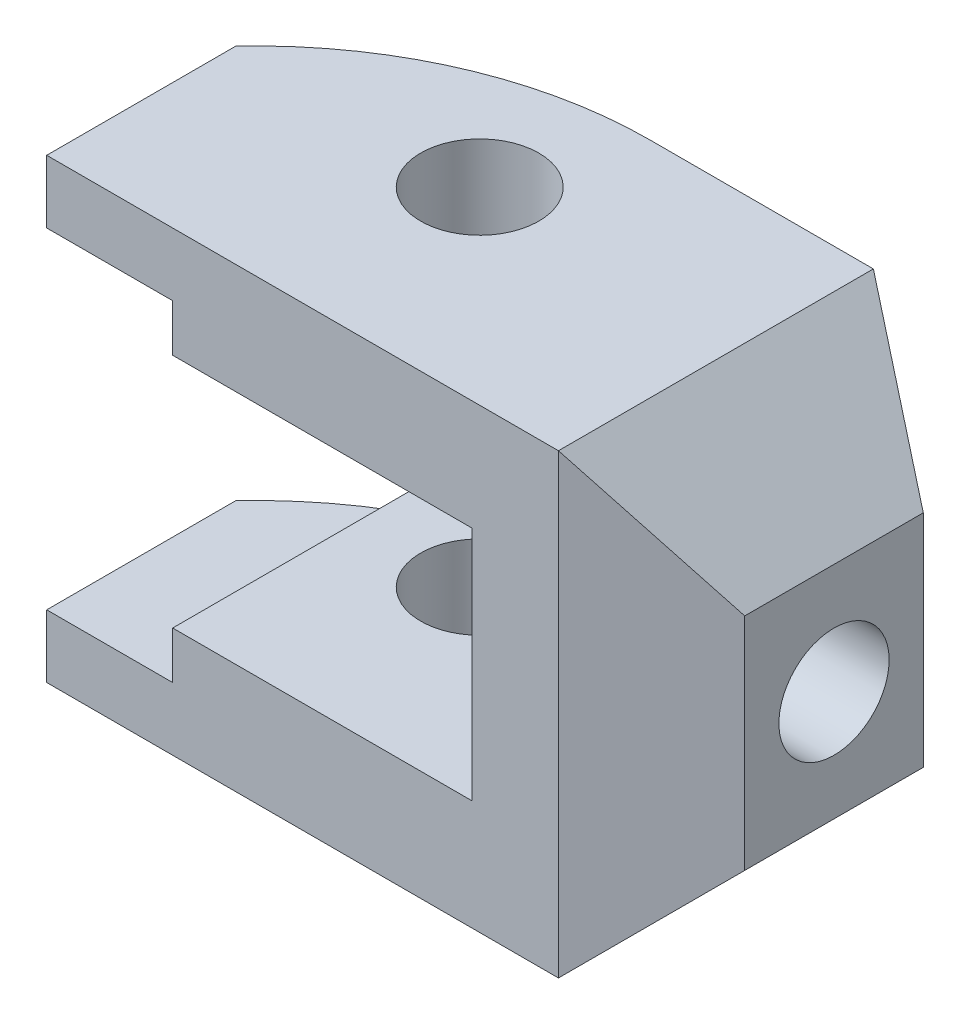
ISO-10303-21;
HEADER;
FILE_DESCRIPTION(('STEP AP214'),'2;1');
FILE_NAME('part.step','',(''),(''),'','','');
FILE_SCHEMA(('AUTOMOTIVE_DESIGN { 1 0 10303 214 1 1 1 1 }'));
ENDSEC;
DATA;
#1=APPLICATION_CONTEXT('core data for automotive mechanical design processes');
#2=APPLICATION_PROTOCOL_DEFINITION('international standard','automotive_design',2000,#1);
#3=PRODUCT_CONTEXT('',#1,'mechanical');
#4=PRODUCT('Part','Part','',(#3));
#5=PRODUCT_RELATED_PRODUCT_CATEGORY('part','',(#4));
#6=PRODUCT_DEFINITION_FORMATION('','',#4);
#7=PRODUCT_DEFINITION_CONTEXT('part definition',#1,'design');
#8=PRODUCT_DEFINITION('design','',#6,#7);
#9=PRODUCT_DEFINITION_SHAPE('','',#8);
#10=(LENGTH_UNIT() NAMED_UNIT(*) SI_UNIT(.MILLI.,.METRE.));
#11=(NAMED_UNIT(*) PLANE_ANGLE_UNIT() SI_UNIT($,.RADIAN.));
#12=(NAMED_UNIT(*) SI_UNIT($,.STERADIAN.) SOLID_ANGLE_UNIT());
#13=UNCERTAINTY_MEASURE_WITH_UNIT(LENGTH_MEASURE(1.E-05),#10,'distance_accuracy_value','');
#14=(GEOMETRIC_REPRESENTATION_CONTEXT(3) GLOBAL_UNCERTAINTY_ASSIGNED_CONTEXT((#13)) GLOBAL_UNIT_ASSIGNED_CONTEXT((#10,
#11,#12)) REPRESENTATION_CONTEXT('',''));
#15=CARTESIAN_POINT('',(0.,0.,0.));
#16=DIRECTION('',(0.,0.,1.));
#17=DIRECTION('',(1.,0.,0.));
#18=AXIS2_PLACEMENT_3D('',#15,#16,#17);
#19=CARTESIAN_POINT('',(0.,58.,0.));
#20=DIRECTION('',(1.,0.,0.));
#21=DIRECTION('',(0.,0.,-1.));
#22=AXIS2_PLACEMENT_3D('',#19,#20,#21);
#23=PLANE('',#22);
#24=DIRECTION('',(0.,-1.,0.));
#25=VECTOR('',#24,1.);
#26=CARTESIAN_POINT('',(0.,58.,-24.));
#27=LINE('',#26,#25);
#28=CARTESIAN_POINT('',(0.,58.,-24.));
#29=VERTEX_POINT('',#28);
#30=CARTESIAN_POINT('',(0.,50.,-24.));
#31=VERTEX_POINT('',#30);
#32=EDGE_CURVE('E268',#29,#31,#27,.T.);
#33=ORIENTED_EDGE('',*,*,#32,.T.);
#34=DIRECTION('',(0.,0.,1.));
#35=VECTOR('',#34,1.);
#36=CARTESIAN_POINT('',(0.,50.,-40.));
#37=LINE('',#36,#35);
#38=CARTESIAN_POINT('',(0.,50.,0.));
#39=VERTEX_POINT('',#38);
#40=EDGE_CURVE('E347',#31,#39,#37,.T.);
#41=ORIENTED_EDGE('',*,*,#40,.T.);
#42=DIRECTION('',(0.,-1.,0.));
#43=VECTOR('',#42,1.);
#44=CARTESIAN_POINT('',(0.,58.,0.));
#45=LINE('',#44,#43);
#46=CARTESIAN_POINT('',(0.,58.,0.));
#47=VERTEX_POINT('',#46);
#48=EDGE_CURVE('E202',#47,#39,#45,.T.);
#49=ORIENTED_EDGE('',*,*,#48,.F.);
#50=DIRECTION('',(0.,0.,1.));
#51=VECTOR('',#50,1.);
#52=CARTESIAN_POINT('',(0.,58.,0.));
#53=LINE('',#52,#51);
#54=EDGE_CURVE('E186',#29,#47,#53,.T.);
#55=ORIENTED_EDGE('',*,*,#54,.F.);
#56=EDGE_LOOP('',(#33,#41,#49,#55));
#57=FACE_BOUND('',#56,.T.);
#58=ADVANCED_FACE('F45',(#57),#23,.F.);
#59=CARTESIAN_POINT('',(36.6606055596467,58.,10.));
#60=DIRECTION('',(0.,-1.,0.));
#61=DIRECTION('',(0.,0.,-1.));
#62=AXIS2_PLACEMENT_3D('',#59,#60,#61);
#63=CYLINDRICAL_SURFACE('',#62,50.);
#64=DIRECTION('',(0.,-1.,0.));
#65=VECTOR('',#64,1.);
#66=CARTESIAN_POINT('',(16.,58.,-35.5317403347236));
#67=LINE('',#66,#65);
#68=CARTESIAN_POINT('',(16.,44.,-35.5317403347236));
#69=VERTEX_POINT('',#68);
#70=CARTESIAN_POINT('',(16.,50.,-35.5317403347236));
#71=VERTEX_POINT('',#70);
#72=EDGE_CURVE('E69',#69,#71,#67,.F.);
#73=ORIENTED_EDGE('',*,*,#72,.T.);
#74=CARTESIAN_POINT('',(36.6606055596467,50.,10.));
#75=DIRECTION('',(0.,1.,0.));
#76=DIRECTION('',(0.,0.,1.));
#77=AXIS2_PLACEMENT_3D('',#74,#75,#76);
#78=CIRCLE('',#77,50.);
#79=EDGE_CURVE('E325',#71,#31,#78,.T.);
#80=ORIENTED_EDGE('',*,*,#79,.T.);
#81=ORIENTED_EDGE('',*,*,#32,.F.);
#82=CARTESIAN_POINT('',(36.6606055596467,58.,10.));
#83=DIRECTION('',(0.,1.,0.));
#84=DIRECTION('',(0.,0.,1.));
#85=AXIS2_PLACEMENT_3D('',#82,#83,#84);
#86=CIRCLE('',#85,50.);
#87=CARTESIAN_POINT('',(36.6606055596467,58.,-40.));
#88=VERTEX_POINT('',#87);
#89=EDGE_CURVE('E280',#88,#29,#86,.T.);
#90=ORIENTED_EDGE('',*,*,#89,.F.);
#91=DIRECTION('',(0.,-1.,0.));
#92=VECTOR('',#91,1.);
#93=CARTESIAN_POINT('',(36.6606055596467,58.,-40.));
#94=LINE('',#93,#92);
#95=CARTESIAN_POINT('',(36.6606055596467,44.,-40.));
#96=VERTEX_POINT('',#95);
#97=EDGE_CURVE('E249',#88,#96,#94,.T.);
#98=ORIENTED_EDGE('',*,*,#97,.T.);
#99=CARTESIAN_POINT('',(36.6606055596467,44.,10.));
#100=DIRECTION('',(0.,1.,0.));
#101=DIRECTION('',(0.,0.,1.));
#102=AXIS2_PLACEMENT_3D('',#99,#100,#101);
#103=CIRCLE('',#102,50.);
#104=EDGE_CURVE('E220',#96,#69,#103,.T.);
#105=ORIENTED_EDGE('',*,*,#104,.T.);
#106=EDGE_LOOP('',(#73,#80,#81,#90,#98,#105));
#107=FACE_BOUND('',#106,.T.);
#108=ADVANCED_FACE('F400',(#107),#63,.T.);
#109=CARTESIAN_POINT('',(31.,58.,-24.));
#110=DIRECTION('',(0.,-1.,0.));
#111=DIRECTION('',(0.,0.,-1.));
#112=AXIS2_PLACEMENT_3D('',#109,#110,#111);
#113=CYLINDRICAL_SURFACE('',#112,7.5);
#114=CARTESIAN_POINT('',(31.,44.,-24.));
#115=DIRECTION('',(0.,1.,0.));
#116=DIRECTION('',(0.,0.,1.));
#117=AXIS2_PLACEMENT_3D('',#114,#115,#116);
#118=CIRCLE('',#117,7.5);
#119=CARTESIAN_POINT('',(31.,44.,-31.5));
#120=VERTEX_POINT('',#119);
#121=EDGE_CURVE('E216',#120,#120,#118,.T.);
#122=CARTESIAN_POINT('',(31.,58.,-24.));
#123=DIRECTION('',(0.,1.,0.));
#124=DIRECTION('',(0.,0.,1.));
#125=AXIS2_PLACEMENT_3D('',#122,#123,#124);
#126=CIRCLE('',#125,7.5);
#127=CARTESIAN_POINT('',(31.,58.,-31.5));
#128=VERTEX_POINT('',#127);
#129=EDGE_CURVE('E291',#128,#128,#126,.T.);
#130=CARTESIAN_POINT('',(31.,44.,-31.5));
#131=CARTESIAN_POINT('',(31.,44.1458333333333,-31.5));
#132=CARTESIAN_POINT('',(31.,44.2916666666667,-31.5));
#133=CARTESIAN_POINT('',(31.,44.5833333333333,-31.5));
#134=CARTESIAN_POINT('',(31.,44.7291666666667,-31.5));
#135=CARTESIAN_POINT('',(31.,45.0208333333333,-31.5));
#136=CARTESIAN_POINT('',(31.,45.1666666666667,-31.5));
#137=CARTESIAN_POINT('',(31.,45.4583333333333,-31.5));
#138=CARTESIAN_POINT('',(31.,45.6041666666667,-31.5));
#139=CARTESIAN_POINT('',(31.,45.8958333333333,-31.5));
#140=CARTESIAN_POINT('',(31.,46.0416666666667,-31.5));
#141=CARTESIAN_POINT('',(31.,46.3333333333333,-31.5));
#142=CARTESIAN_POINT('',(31.,46.4791666666667,-31.5));
#143=CARTESIAN_POINT('',(31.,46.7708333333333,-31.5));
#144=CARTESIAN_POINT('',(31.,46.9166666666667,-31.5));
#145=CARTESIAN_POINT('',(31.,47.2083333333333,-31.5));
#146=CARTESIAN_POINT('',(31.,47.3541666666667,-31.5));
#147=CARTESIAN_POINT('',(31.,47.6458333333333,-31.5));
#148=CARTESIAN_POINT('',(31.,47.7916666666667,-31.5));
#149=CARTESIAN_POINT('',(31.,48.0833333333333,-31.5));
#150=CARTESIAN_POINT('',(31.,48.2291666666667,-31.5));
#151=CARTESIAN_POINT('',(31.,48.5208333333333,-31.5));
#152=CARTESIAN_POINT('',(31.,48.6666666666667,-31.5));
#153=CARTESIAN_POINT('',(31.,48.9583333333333,-31.5));
#154=CARTESIAN_POINT('',(31.,49.1041666666667,-31.5));
#155=CARTESIAN_POINT('',(31.,49.3958333333333,-31.5));
#156=CARTESIAN_POINT('',(31.,49.5416666666667,-31.5));
#157=CARTESIAN_POINT('',(31.,49.8333333333333,-31.5));
#158=CARTESIAN_POINT('',(31.,49.9791666666667,-31.5));
#159=CARTESIAN_POINT('',(31.,50.2708333333333,-31.5));
#160=CARTESIAN_POINT('',(31.,50.4166666666667,-31.5));
#161=CARTESIAN_POINT('',(31.,50.7083333333333,-31.5));
#162=CARTESIAN_POINT('',(31.,50.8541666666667,-31.5));
#163=CARTESIAN_POINT('',(31.,51.1458333333333,-31.5));
#164=CARTESIAN_POINT('',(31.,51.2916666666667,-31.5));
#165=CARTESIAN_POINT('',(31.,51.5833333333333,-31.5));
#166=CARTESIAN_POINT('',(31.,51.7291666666667,-31.5));
#167=CARTESIAN_POINT('',(31.,52.0208333333333,-31.5));
#168=CARTESIAN_POINT('',(31.,52.1666666666667,-31.5));
#169=CARTESIAN_POINT('',(31.,52.4583333333333,-31.5));
#170=CARTESIAN_POINT('',(31.,52.6041666666667,-31.5));
#171=CARTESIAN_POINT('',(31.,52.8958333333333,-31.5));
#172=CARTESIAN_POINT('',(31.,53.0416666666667,-31.5));
#173=CARTESIAN_POINT('',(31.,53.3333333333333,-31.5));
#174=CARTESIAN_POINT('',(31.,53.4791666666667,-31.5));
#175=CARTESIAN_POINT('',(31.,53.7708333333333,-31.5));
#176=CARTESIAN_POINT('',(31.,53.9166666666667,-31.5));
#177=CARTESIAN_POINT('',(31.,54.2083333333333,-31.5));
#178=CARTESIAN_POINT('',(31.,54.3541666666667,-31.5));
#179=CARTESIAN_POINT('',(31.,54.6458333333333,-31.5));
#180=CARTESIAN_POINT('',(31.,54.7916666666667,-31.5));
#181=CARTESIAN_POINT('',(31.,55.0833333333333,-31.5));
#182=CARTESIAN_POINT('',(31.,55.2291666666667,-31.5));
#183=CARTESIAN_POINT('',(31.,55.5208333333333,-31.5));
#184=CARTESIAN_POINT('',(31.,55.6666666666667,-31.5));
#185=CARTESIAN_POINT('',(31.,55.9583333333333,-31.5));
#186=CARTESIAN_POINT('',(31.,56.1041666666667,-31.5));
#187=CARTESIAN_POINT('',(31.,56.3958333333333,-31.5));
#188=CARTESIAN_POINT('',(31.,56.5416666666667,-31.5));
#189=CARTESIAN_POINT('',(31.,56.8333333333333,-31.5));
#190=CARTESIAN_POINT('',(31.,56.9791666666667,-31.5));
#191=CARTESIAN_POINT('',(31.,57.2708333333333,-31.5));
#192=CARTESIAN_POINT('',(31.,57.4166666666667,-31.5));
#193=CARTESIAN_POINT('',(31.,57.7083333333333,-31.5));
#194=CARTESIAN_POINT('',(31.,57.8541666666667,-31.5));
#195=CARTESIAN_POINT('',(31.,58.,-31.5));
#196=B_SPLINE_CURVE_WITH_KNOTS('',3,(#130,#131,#132,#133,#134,#135,#136,#137,#138,#139,#140,
#141,#142,#143,#144,#145,#146,#147,#148,#149,#150,#151,#152,#153,#154,#155,#156,#157,#158,#159,
#160,#161,#162,#163,#164,#165,#166,#167,#168,#169,#170,#171,#172,#173,#174,#175,#176,#177,#178,
#179,#180,#181,#182,#183,#184,#185,#186,#187,#188,#189,#190,#191,#192,#193,#194,#195),
.UNSPECIFIED.,.F.,.F.,(4,2,2,2,2,2,2,2,2,2,2,2,2,2,2,2,2,2,2,2,2,2,2,2,2,2,2,2,2,2,2,2,4),(0.,
0.4375,0.875000000000001,1.3125,1.74999999999999,2.1875,2.625,3.0625,3.5,3.9375,4.375,4.8125,
5.25,5.6875,6.125,6.5625,7.,7.4375,7.875,8.31249999999999,8.74999999999999,9.18749999999999,
9.62499999999999,10.0625,10.5,10.9375,11.375,11.8125,12.25,12.6875,13.125,13.5625,14.),.UNSPECIFIED.);
#197=EDGE_CURVE('BSEAM406',#120,#128,#196,.T.);
#198=ORIENTED_EDGE('',*,*,#121,.F.);
#199=ORIENTED_EDGE('',*,*,#129,.T.);
#200=ORIENTED_EDGE('',*,*,#197,.T.);
#201=ORIENTED_EDGE('',*,*,#197,.F.);
#202=EDGE_LOOP('',(#198,#200,#199,#201));
#203=FACE_BOUND('',#202,.T.);
#204=ADVANCED_FACE('F406',(#203),#113,.F.);
#205=CARTESIAN_POINT('',(36.6606055596467,58.,10.));
#206=DIRECTION('',(0.,1.,0.));
#207=DIRECTION('',(0.,0.,1.));
#208=AXIS2_PLACEMENT_3D('',#205,#206,#207);
#209=PLANE('',#208);
#210=DIRECTION('',(0.,0.,-1.));
#211=VECTOR('',#210,1.);
#212=CARTESIAN_POINT('',(65.,58.,0.));
#213=LINE('',#212,#211);
#214=CARTESIAN_POINT('',(65.,58.,0.));
#215=VERTEX_POINT('',#214);
#216=CARTESIAN_POINT('',(65.,58.,-40.));
#217=VERTEX_POINT('',#216);
#218=EDGE_CURVE('E158',#215,#217,#213,.T.);
#219=ORIENTED_EDGE('',*,*,#218,.T.);
#220=DIRECTION('',(-1.,0.,0.));
#221=VECTOR('',#220,1.);
#222=CARTESIAN_POINT('',(65.,58.,-40.));
#223=LINE('',#222,#221);
#224=EDGE_CURVE('E191',#217,#88,#223,.T.);
#225=ORIENTED_EDGE('',*,*,#224,.T.);
#226=ORIENTED_EDGE('',*,*,#89,.T.);
#227=ORIENTED_EDGE('',*,*,#54,.T.);
#228=DIRECTION('',(1.,0.,0.));
#229=VECTOR('',#228,1.);
#230=CARTESIAN_POINT('',(0.,58.,0.));
#231=LINE('',#230,#229);
#232=EDGE_CURVE('E182',#47,#215,#231,.T.);
#233=ORIENTED_EDGE('',*,*,#232,.T.);
#234=EDGE_LOOP('',(#219,#225,#226,#227,#233));
#235=FACE_BOUND('',#234,.T.);
#236=ORIENTED_EDGE('',*,*,#129,.F.);
#237=EDGE_LOOP('',(#236));
#238=FACE_BOUND('',#237,.T.);
#239=ADVANCED_FACE('F183',(#235,#238),#209,.T.);
#240=CARTESIAN_POINT('',(36.6606055596467,0.,10.));
#241=DIRECTION('',(0.,1.,0.));
#242=DIRECTION('',(0.,0.,1.));
#243=AXIS2_PLACEMENT_3D('',#240,#241,#242);
#244=PLANE('',#243);
#245=DIRECTION('',(-1.,0.,0.));
#246=VECTOR('',#245,1.);
#247=CARTESIAN_POINT('',(65.,0.,-40.));
#248=LINE('',#247,#246);
#249=CARTESIAN_POINT('',(65.,0.,-40.));
#250=VERTEX_POINT('',#249);
#251=CARTESIAN_POINT('',(36.6606055596467,0.,-40.));
#252=VERTEX_POINT('',#251);
#253=EDGE_CURVE('E245',#250,#252,#248,.T.);
#254=ORIENTED_EDGE('',*,*,#253,.F.);
#255=DIRECTION('',(0.,0.,-1.));
#256=VECTOR('',#255,1.);
#257=CARTESIAN_POINT('',(65.,0.,0.));
#258=LINE('',#257,#256);
#259=CARTESIAN_POINT('',(65.,0.,0.));
#260=VERTEX_POINT('',#259);
#261=EDGE_CURVE('E255',#260,#250,#258,.T.);
#262=ORIENTED_EDGE('',*,*,#261,.F.);
#263=DIRECTION('',(1.,0.,0.));
#264=VECTOR('',#263,1.);
#265=CARTESIAN_POINT('',(0.,0.,0.));
#266=LINE('',#265,#264);
#267=CARTESIAN_POINT('',(0.,0.,0.));
#268=VERTEX_POINT('',#267);
#269=EDGE_CURVE('E196',#268,#260,#266,.T.);
#270=ORIENTED_EDGE('',*,*,#269,.F.);
#271=DIRECTION('',(0.,0.,1.));
#272=VECTOR('',#271,1.);
#273=CARTESIAN_POINT('',(0.,0.,0.));
#274=LINE('',#273,#272);
#275=CARTESIAN_POINT('',(0.,0.,-24.));
#276=VERTEX_POINT('',#275);
#277=EDGE_CURVE('E264',#276,#268,#274,.T.);
#278=ORIENTED_EDGE('',*,*,#277,.F.);
#279=CARTESIAN_POINT('',(36.6606055596467,0.,10.));
#280=DIRECTION('',(0.,1.,0.));
#281=DIRECTION('',(0.,0.,1.));
#282=AXIS2_PLACEMENT_3D('',#279,#280,#281);
#283=CIRCLE('',#282,50.);
#284=EDGE_CURVE('E258',#252,#276,#283,.T.);
#285=ORIENTED_EDGE('',*,*,#284,.F.);
#286=EDGE_LOOP('',(#254,#262,#270,#278,#285));
#287=FACE_BOUND('',#286,.T.);
#288=CARTESIAN_POINT('',(31.,0.,-24.));
#289=DIRECTION('',(0.,1.,0.));
#290=DIRECTION('',(0.,0.,1.));
#291=AXIS2_PLACEMENT_3D('',#288,#289,#290);
#292=CIRCLE('',#291,7.5);
#293=CARTESIAN_POINT('',(31.,0.,-31.5));
#294=VERTEX_POINT('',#293);
#295=EDGE_CURVE('E287',#294,#294,#292,.T.);
#296=ORIENTED_EDGE('',*,*,#295,.T.);
#297=EDGE_LOOP('',(#296));
#298=FACE_BOUND('',#297,.T.);
#299=ADVANCED_FACE('F253',(#287,#298),#244,.F.);
#300=CARTESIAN_POINT('',(0.,8.,0.));
#301=VERTEX_POINT('',#300);
#302=EDGE_CURVE('E198',#301,#268,#45,.T.);
#303=ORIENTED_EDGE('',*,*,#302,.F.);
#304=DIRECTION('',(0.,0.,1.));
#305=VECTOR('',#304,1.);
#306=CARTESIAN_POINT('',(0.,8.,-40.));
#307=LINE('',#306,#305);
#308=CARTESIAN_POINT('',(0.,8.,-24.));
#309=VERTEX_POINT('',#308);
#310=EDGE_CURVE('E348',#309,#301,#307,.T.);
#311=ORIENTED_EDGE('',*,*,#310,.F.);
#312=EDGE_CURVE('E273',#309,#276,#27,.T.);
#313=ORIENTED_EDGE('',*,*,#312,.T.);
#314=ORIENTED_EDGE('',*,*,#277,.T.);
#315=EDGE_LOOP('',(#303,#311,#313,#314));
#316=FACE_BOUND('',#315,.T.);
#317=ADVANCED_FACE('F47',(#316),#23,.F.);
#318=CARTESIAN_POINT('',(0.,58.,0.));
#319=DIRECTION('',(0.,0.,-1.));
#320=DIRECTION('',(-1.,0.,0.));
#321=AXIS2_PLACEMENT_3D('',#318,#319,#320);
#322=PLANE('',#321);
#323=ORIENTED_EDGE('',*,*,#48,.T.);
#324=DIRECTION('',(-1.,0.,0.));
#325=VECTOR('',#324,1.);
#326=CARTESIAN_POINT('',(0.,50.,0.));
#327=LINE('',#326,#325);
#328=CARTESIAN_POINT('',(16.,50.,0.));
#329=VERTEX_POINT('',#328);
#330=EDGE_CURVE('E352',#329,#39,#327,.T.);
#331=ORIENTED_EDGE('',*,*,#330,.F.);
#332=DIRECTION('',(0.,1.,0.));
#333=VECTOR('',#332,1.);
#334=CARTESIAN_POINT('',(16.,50.,0.));
#335=LINE('',#334,#333);
#336=CARTESIAN_POINT('',(16.,44.,0.));
#337=VERTEX_POINT('',#336);
#338=EDGE_CURVE('E366',#337,#329,#335,.T.);
#339=ORIENTED_EDGE('',*,*,#338,.F.);
#340=DIRECTION('',(-1.,0.,0.));
#341=VECTOR('',#340,1.);
#342=CARTESIAN_POINT('',(0.,44.,0.));
#343=LINE('',#342,#341);
#344=CARTESIAN_POINT('',(54.,44.,0.));
#345=VERTEX_POINT('',#344);
#346=EDGE_CURVE('E313',#345,#337,#343,.T.);
#347=ORIENTED_EDGE('',*,*,#346,.F.);
#348=DIRECTION('',(0.,1.,0.));
#349=VECTOR('',#348,1.);
#350=CARTESIAN_POINT('',(54.,44.,0.));
#351=LINE('',#350,#349);
#352=CARTESIAN_POINT('',(54.,14.,0.));
#353=VERTEX_POINT('',#352);
#354=EDGE_CURVE('E318',#353,#345,#351,.T.);
#355=ORIENTED_EDGE('',*,*,#354,.F.);
#356=DIRECTION('',(1.,0.,0.));
#357=VECTOR('',#356,1.);
#358=CARTESIAN_POINT('',(0.,14.,0.));
#359=LINE('',#358,#357);
#360=CARTESIAN_POINT('',(16.,14.,0.));
#361=VERTEX_POINT('',#360);
#362=EDGE_CURVE('E322',#361,#353,#359,.T.);
#363=ORIENTED_EDGE('',*,*,#362,.F.);
#364=CARTESIAN_POINT('',(16.,8.,0.));
#365=VERTEX_POINT('',#364);
#366=EDGE_CURVE('E363',#365,#361,#335,.T.);
#367=ORIENTED_EDGE('',*,*,#366,.F.);
#368=DIRECTION('',(1.,0.,0.));
#369=VECTOR('',#368,1.);
#370=CARTESIAN_POINT('',(0.,8.,0.));
#371=LINE('',#370,#369);
#372=EDGE_CURVE('E178',#301,#365,#371,.T.);
#373=ORIENTED_EDGE('',*,*,#372,.F.);
#374=ORIENTED_EDGE('',*,*,#302,.T.);
#375=ORIENTED_EDGE('',*,*,#269,.T.);
#376=DIRECTION('',(0.,-1.,0.));
#377=VECTOR('',#376,1.);
#378=CARTESIAN_POINT('',(65.,58.,0.));
#379=LINE('',#378,#377);
#380=EDGE_CURVE('E174',#215,#260,#379,.T.);
#381=ORIENTED_EDGE('',*,*,#380,.F.);
#382=ORIENTED_EDGE('',*,*,#232,.F.);
#383=EDGE_LOOP('',(#323,#331,#339,#347,#355,#363,#367,#373,#374,#375,#381,#382));
#384=FACE_BOUND('',#383,.T.);
#385=ADVANCED_FACE('F194',(#384),#322,.F.);
#386=CARTESIAN_POINT('',(65.,58.,0.));
#387=DIRECTION('',(-0.500000000000001,0.,-0.866025403784438));
#388=DIRECTION('',(-0.866025403784438,0.,0.500000000000001));
#389=AXIS2_PLACEMENT_3D('',#386,#387,#388);
#390=PLANE('',#389);
#391=DIRECTION('',(0.,-1.,0.));
#392=VECTOR('',#391,1.);
#393=CARTESIAN_POINT('',(80.,58.,-8.66025403784441));
#394=LINE('',#393,#392);
#395=CARTESIAN_POINT('',(80.,43.0000000000001,-8.66025403784441));
#396=VERTEX_POINT('',#395);
#397=CARTESIAN_POINT('',(80.,14.9999999999998,-8.66025403784441));
#398=VERTEX_POINT('',#397);
#399=EDGE_CURVE('E176',#396,#398,#394,.T.);
#400=ORIENTED_EDGE('',*,*,#399,.F.);
#401=DIRECTION('',(-0.65465367070798,0.654653670707973,0.37796447300923));
#402=VECTOR('',#401,1.);
#403=CARTESIAN_POINT('',(65.,58.,0.));
#404=LINE('',#403,#402);
#405=EDGE_CURVE('E161',#396,#215,#404,.T.);
#406=ORIENTED_EDGE('',*,*,#405,.T.);
#407=ORIENTED_EDGE('',*,*,#380,.T.);
#408=DIRECTION('',(0.65465367070798,0.654653670707973,-0.37796447300923));
#409=VECTOR('',#408,1.);
#410=CARTESIAN_POINT('',(89.8571428571428,24.8571428571425,-14.3512781198564));
#411=LINE('',#410,#409);
#412=EDGE_CURVE('E179',#260,#398,#411,.T.);
#413=ORIENTED_EDGE('',*,*,#412,.T.);
#414=EDGE_LOOP('',(#400,#406,#407,#413));
#415=FACE_BOUND('',#414,.T.);
#416=ADVANCED_FACE('F171',(#415),#390,.F.);
#417=CARTESIAN_POINT('',(80.,58.,-8.66025403784441));
#418=DIRECTION('',(-1.,0.,0.));
#419=DIRECTION('',(0.,0.,1.));
#420=AXIS2_PLACEMENT_3D('',#417,#418,#419);
#421=PLANE('',#420);
#422=CARTESIAN_POINT('',(80.,29.,-20.));
#423=DIRECTION('',(1.,0.,0.));
#424=DIRECTION('',(0.,0.,-1.));
#425=AXIS2_PLACEMENT_3D('',#422,#423,#424);
#426=CIRCLE('',#425,7.);
#427=CARTESIAN_POINT('',(80.,29.,-27.));
#428=VERTEX_POINT('',#427);
#429=EDGE_CURVE('E378',#428,#428,#426,.T.);
#430=ORIENTED_EDGE('',*,*,#429,.F.);
#431=EDGE_LOOP('',(#430));
#432=FACE_BOUND('',#431,.T.);
#433=DIRECTION('',(0.,-1.,0.));
#434=VECTOR('',#433,1.);
#435=CARTESIAN_POINT('',(80.,58.,-31.3397459621556));
#436=LINE('',#435,#434);
#437=CARTESIAN_POINT('',(80.,43.0000000000001,-31.3397459621556));
#438=VERTEX_POINT('',#437);
#439=CARTESIAN_POINT('',(80.,14.9999999999998,-31.3397459621556));
#440=VERTEX_POINT('',#439);
#441=EDGE_CURVE('E204',#438,#440,#436,.T.);
#442=ORIENTED_EDGE('',*,*,#441,.F.);
#443=DIRECTION('',(0.,0.,-1.));
#444=VECTOR('',#443,1.);
#445=CARTESIAN_POINT('',(80.,43.0000000000001,0.));
#446=LINE('',#445,#444);
#447=EDGE_CURVE('E62',#396,#438,#446,.T.);
#448=ORIENTED_EDGE('',*,*,#447,.F.);
#449=ORIENTED_EDGE('',*,*,#399,.T.);
#450=DIRECTION('',(0.,0.,-1.));
#451=VECTOR('',#450,1.);
#452=CARTESIAN_POINT('',(80.,14.9999999999998,0.));
#453=LINE('',#452,#451);
#454=EDGE_CURVE('E166',#398,#440,#453,.T.);
#455=ORIENTED_EDGE('',*,*,#454,.T.);
#456=EDGE_LOOP('',(#442,#448,#449,#455));
#457=FACE_BOUND('',#456,.T.);
#458=ADVANCED_FACE('F478',(#432,#457),#421,.F.);
#459=CARTESIAN_POINT('',(65.,58.,-40.));
#460=DIRECTION('',(-0.500000000000001,0.,0.866025403784438));
#461=DIRECTION('',(0.866025403784438,0.,0.500000000000001));
#462=AXIS2_PLACEMENT_3D('',#459,#460,#461);
#463=PLANE('',#462);
#464=DIRECTION('',(0.,-1.,0.));
#465=VECTOR('',#464,1.);
#466=CARTESIAN_POINT('',(65.,58.,-40.));
#467=LINE('',#466,#465);
#468=EDGE_CURVE('E234',#217,#250,#467,.T.);
#469=ORIENTED_EDGE('',*,*,#468,.F.);
#470=DIRECTION('',(0.65465367070798,-0.654653670707973,0.37796447300923));
#471=VECTOR('',#470,1.);
#472=CARTESIAN_POINT('',(65.,58.,-40.));
#473=LINE('',#472,#471);
#474=EDGE_CURVE('E11',#217,#438,#473,.T.);
#475=ORIENTED_EDGE('',*,*,#474,.T.);
#476=ORIENTED_EDGE('',*,*,#441,.T.);
#477=DIRECTION('',(-0.65465367070798,-0.654653670707973,-0.37796447300923));
#478=VECTOR('',#477,1.);
#479=CARTESIAN_POINT('',(89.8571428571428,24.8571428571425,-25.6487218801436));
#480=LINE('',#479,#478);
#481=EDGE_CURVE('E55',#440,#250,#480,.T.);
#482=ORIENTED_EDGE('',*,*,#481,.T.);
#483=EDGE_LOOP('',(#469,#475,#476,#482));
#484=FACE_BOUND('',#483,.T.);
#485=ADVANCED_FACE('F233',(#484),#463,.F.);
#486=CARTESIAN_POINT('',(65.,58.,-40.));
#487=DIRECTION('',(0.,0.,1.));
#488=DIRECTION('',(1.,0.,0.));
#489=AXIS2_PLACEMENT_3D('',#486,#487,#488);
#490=PLANE('',#489);
#491=DIRECTION('',(0.,1.,0.));
#492=VECTOR('',#491,1.);
#493=CARTESIAN_POINT('',(54.,44.,-40.));
#494=LINE('',#493,#492);
#495=CARTESIAN_POINT('',(54.,14.,-40.));
#496=VERTEX_POINT('',#495);
#497=CARTESIAN_POINT('',(54.,44.,-40.));
#498=VERTEX_POINT('',#497);
#499=EDGE_CURVE('E329',#496,#498,#494,.T.);
#500=ORIENTED_EDGE('',*,*,#499,.T.);
#501=DIRECTION('',(-1.,0.,0.));
#502=VECTOR('',#501,1.);
#503=CARTESIAN_POINT('',(0.,44.,-40.));
#504=LINE('',#503,#502);
#505=EDGE_CURVE('E310',#498,#96,#504,.T.);
#506=ORIENTED_EDGE('',*,*,#505,.T.);
#507=ORIENTED_EDGE('',*,*,#97,.F.);
#508=ORIENTED_EDGE('',*,*,#224,.F.);
#509=ORIENTED_EDGE('',*,*,#468,.T.);
#510=ORIENTED_EDGE('',*,*,#253,.T.);
#511=CARTESIAN_POINT('',(36.6606055596467,14.,-40.));
#512=VERTEX_POINT('',#511);
#513=EDGE_CURVE('E272',#512,#252,#94,.T.);
#514=ORIENTED_EDGE('',*,*,#513,.F.);
#515=DIRECTION('',(1.,0.,0.));
#516=VECTOR('',#515,1.);
#517=CARTESIAN_POINT('',(0.,14.,-40.));
#518=LINE('',#517,#516);
#519=EDGE_CURVE('E317',#512,#496,#518,.T.);
#520=ORIENTED_EDGE('',*,*,#519,.T.);
#521=EDGE_LOOP('',(#500,#506,#507,#508,#509,#510,#514,#520));
#522=FACE_BOUND('',#521,.T.);
#523=ADVANCED_FACE('F243',(#522),#490,.F.);
#524=CARTESIAN_POINT('',(36.6606055596467,8.,10.));
#525=DIRECTION('',(0.,-1.,0.));
#526=DIRECTION('',(0.,0.,-1.));
#527=AXIS2_PLACEMENT_3D('',#524,#525,#526);
#528=CIRCLE('',#527,50.);
#529=CARTESIAN_POINT('',(16.,8.,-35.5317403347236));
#530=VERTEX_POINT('',#529);
#531=EDGE_CURVE('E224',#309,#530,#528,.T.);
#532=ORIENTED_EDGE('',*,*,#531,.T.);
#533=DIRECTION('',(0.,-1.,0.));
#534=VECTOR('',#533,1.);
#535=CARTESIAN_POINT('',(16.,58.,-35.5317403347236));
#536=LINE('',#535,#534);
#537=CARTESIAN_POINT('',(16.,14.,-35.5317403347236));
#538=VERTEX_POINT('',#537);
#539=EDGE_CURVE('E343',#530,#538,#536,.F.);
#540=ORIENTED_EDGE('',*,*,#539,.T.);
#541=CARTESIAN_POINT('',(36.6606055596467,14.,10.));
#542=DIRECTION('',(0.,-1.,0.));
#543=DIRECTION('',(0.,0.,-1.));
#544=AXIS2_PLACEMENT_3D('',#541,#542,#543);
#545=CIRCLE('',#544,50.);
#546=EDGE_CURVE('E214',#538,#512,#545,.T.);
#547=ORIENTED_EDGE('',*,*,#546,.T.);
#548=ORIENTED_EDGE('',*,*,#513,.T.);
#549=ORIENTED_EDGE('',*,*,#284,.T.);
#550=ORIENTED_EDGE('',*,*,#312,.F.);
#551=EDGE_LOOP('',(#532,#540,#547,#548,#549,#550));
#552=FACE_BOUND('',#551,.T.);
#553=ADVANCED_FACE('F409',(#552),#63,.T.);
#554=CARTESIAN_POINT('',(31.,14.,-24.));
#555=DIRECTION('',(0.,-1.,0.));
#556=DIRECTION('',(0.,0.,-1.));
#557=AXIS2_PLACEMENT_3D('',#554,#555,#556);
#558=CIRCLE('',#557,7.5);
#559=CARTESIAN_POINT('',(31.,14.,-31.5));
#560=VERTEX_POINT('',#559);
#561=EDGE_CURVE('E210',#560,#560,#558,.T.);
#562=CARTESIAN_POINT('',(31.,14.,-31.5));
#563=CARTESIAN_POINT('',(31.,13.8541666666667,-31.5));
#564=CARTESIAN_POINT('',(31.,13.7083333333333,-31.5));
#565=CARTESIAN_POINT('',(31.,13.4166666666667,-31.5));
#566=CARTESIAN_POINT('',(31.,13.2708333333333,-31.5));
#567=CARTESIAN_POINT('',(31.,12.9791666666667,-31.5));
#568=CARTESIAN_POINT('',(31.,12.8333333333333,-31.5));
#569=CARTESIAN_POINT('',(31.,12.5416666666667,-31.5));
#570=CARTESIAN_POINT('',(31.,12.3958333333333,-31.5));
#571=CARTESIAN_POINT('',(31.,12.1041666666667,-31.5));
#572=CARTESIAN_POINT('',(31.,11.9583333333333,-31.5));
#573=CARTESIAN_POINT('',(31.,11.6666666666667,-31.5));
#574=CARTESIAN_POINT('',(31.,11.5208333333333,-31.5));
#575=CARTESIAN_POINT('',(31.,11.2291666666667,-31.5));
#576=CARTESIAN_POINT('',(31.,11.0833333333333,-31.5));
#577=CARTESIAN_POINT('',(31.,10.7916666666667,-31.5));
#578=CARTESIAN_POINT('',(31.,10.6458333333333,-31.5));
#579=CARTESIAN_POINT('',(31.,10.3541666666667,-31.5));
#580=CARTESIAN_POINT('',(31.,10.2083333333333,-31.5));
#581=CARTESIAN_POINT('',(31.,9.91666666666667,-31.5));
#582=CARTESIAN_POINT('',(31.,9.77083333333333,-31.5));
#583=CARTESIAN_POINT('',(31.,9.47916666666667,-31.5));
#584=CARTESIAN_POINT('',(31.,9.33333333333333,-31.5));
#585=CARTESIAN_POINT('',(31.,9.04166666666667,-31.5));
#586=CARTESIAN_POINT('',(31.,8.89583333333333,-31.5));
#587=CARTESIAN_POINT('',(31.,8.60416666666667,-31.5));
#588=CARTESIAN_POINT('',(31.,8.45833333333333,-31.5));
#589=CARTESIAN_POINT('',(31.,8.16666666666667,-31.5));
#590=CARTESIAN_POINT('',(31.,8.02083333333333,-31.5));
#591=CARTESIAN_POINT('',(31.,7.72916666666667,-31.5));
#592=CARTESIAN_POINT('',(31.,7.58333333333333,-31.5));
#593=CARTESIAN_POINT('',(31.,7.29166666666667,-31.5));
#594=CARTESIAN_POINT('',(31.,7.14583333333333,-31.5));
#595=CARTESIAN_POINT('',(31.,6.85416666666667,-31.5));
#596=CARTESIAN_POINT('',(31.,6.70833333333333,-31.5));
#597=CARTESIAN_POINT('',(31.,6.41666666666667,-31.5));
#598=CARTESIAN_POINT('',(31.,6.27083333333333,-31.5));
#599=CARTESIAN_POINT('',(31.,5.97916666666667,-31.5));
#600=CARTESIAN_POINT('',(31.,5.83333333333333,-31.5));
#601=CARTESIAN_POINT('',(31.,5.54166666666666,-31.5));
#602=CARTESIAN_POINT('',(31.,5.39583333333333,-31.5));
#603=CARTESIAN_POINT('',(31.,5.10416666666666,-31.5));
#604=CARTESIAN_POINT('',(31.,4.95833333333333,-31.5));
#605=CARTESIAN_POINT('',(31.,4.66666666666667,-31.5));
#606=CARTESIAN_POINT('',(31.,4.52083333333333,-31.5));
#607=CARTESIAN_POINT('',(31.,4.22916666666667,-31.5));
#608=CARTESIAN_POINT('',(31.,4.08333333333333,-31.5));
#609=CARTESIAN_POINT('',(31.,3.79166666666667,-31.5));
#610=CARTESIAN_POINT('',(31.,3.64583333333333,-31.5));
#611=CARTESIAN_POINT('',(31.,3.35416666666667,-31.5));
#612=CARTESIAN_POINT('',(31.,3.20833333333333,-31.5));
#613=CARTESIAN_POINT('',(31.,2.91666666666666,-31.5));
#614=CARTESIAN_POINT('',(31.,2.77083333333333,-31.5));
#615=CARTESIAN_POINT('',(31.,2.47916666666667,-31.5));
#616=CARTESIAN_POINT('',(31.,2.33333333333334,-31.5));
#617=CARTESIAN_POINT('',(31.,2.04166666666667,-31.5));
#618=CARTESIAN_POINT('',(31.,1.89583333333333,-31.5));
#619=CARTESIAN_POINT('',(31.,1.60416666666667,-31.5));
#620=CARTESIAN_POINT('',(31.,1.45833333333333,-31.5));
#621=CARTESIAN_POINT('',(31.,1.16666666666667,-31.5));
#622=CARTESIAN_POINT('',(31.,1.02083333333333,-31.5));
#623=CARTESIAN_POINT('',(31.,0.729166666666667,-31.5));
#624=CARTESIAN_POINT('',(31.,0.583333333333334,-31.5));
#625=CARTESIAN_POINT('',(31.,0.291666666666667,-31.5));
#626=CARTESIAN_POINT('',(31.,0.145833333333333,-31.5));
#627=CARTESIAN_POINT('',(31.,0.,-31.5));
#628=B_SPLINE_CURVE_WITH_KNOTS('',3,(#562,#563,#564,#565,#566,#567,#568,#569,#570,#571,#572,
#573,#574,#575,#576,#577,#578,#579,#580,#581,#582,#583,#584,#585,#586,#587,#588,#589,#590,#591,
#592,#593,#594,#595,#596,#597,#598,#599,#600,#601,#602,#603,#604,#605,#606,#607,#608,#609,#610,
#611,#612,#613,#614,#615,#616,#617,#618,#619,#620,#621,#622,#623,#624,#625,#626,#627),
.UNSPECIFIED.,.F.,.F.,(4,2,2,2,2,2,2,2,2,2,2,2,2,2,2,2,2,2,2,2,2,2,2,2,2,2,2,2,2,2,2,2,4),(0.,
0.4375,0.875000000000001,1.3125,1.75,2.1875,2.625,3.0625,3.5,3.9375,4.375,4.8125,5.25,5.6875,
6.125,6.5625,7.,7.4375,7.875,8.3125,8.75,9.1875,9.62499999999999,10.0625,10.5,10.9375,11.375,
11.8125,12.25,12.6875,13.125,13.5625,14.),.UNSPECIFIED.);
#629=EDGE_CURVE('BSEAM470',#560,#294,#628,.T.);
#630=ORIENTED_EDGE('',*,*,#561,.F.);
#631=ORIENTED_EDGE('',*,*,#295,.F.);
#632=ORIENTED_EDGE('',*,*,#629,.T.);
#633=ORIENTED_EDGE('',*,*,#629,.F.);
#634=EDGE_LOOP('',(#630,#632,#631,#633));
#635=FACE_BOUND('',#634,.T.);
#636=ADVANCED_FACE('F470',(#635),#113,.F.);
#637=CARTESIAN_POINT('',(0.,44.,-40.));
#638=DIRECTION('',(0.,1.,0.));
#639=DIRECTION('',(0.,0.,1.));
#640=AXIS2_PLACEMENT_3D('',#637,#638,#639);
#641=PLANE('',#640);
#642=ORIENTED_EDGE('',*,*,#121,.T.);
#643=EDGE_LOOP('',(#642));
#644=FACE_BOUND('',#643,.T.);
#645=ORIENTED_EDGE('',*,*,#346,.T.);
#646=DIRECTION('',(0.,0.,-1.));
#647=VECTOR('',#646,1.);
#648=CARTESIAN_POINT('',(16.,44.,-40.));
#649=LINE('',#648,#647);
#650=EDGE_CURVE('E340',#337,#69,#649,.T.);
#651=ORIENTED_EDGE('',*,*,#650,.T.);
#652=ORIENTED_EDGE('',*,*,#104,.F.);
#653=ORIENTED_EDGE('',*,*,#505,.F.);
#654=DIRECTION('',(0.,0.,1.));
#655=VECTOR('',#654,1.);
#656=CARTESIAN_POINT('',(54.,44.,-40.));
#657=LINE('',#656,#655);
#658=EDGE_CURVE('E215',#498,#345,#657,.T.);
#659=ORIENTED_EDGE('',*,*,#658,.T.);
#660=EDGE_LOOP('',(#645,#651,#652,#653,#659));
#661=FACE_BOUND('',#660,.T.);
#662=ADVANCED_FACE('F435',(#644,#661),#641,.F.);
#663=CARTESIAN_POINT('',(0.,14.,-40.));
#664=DIRECTION('',(0.,-1.,0.));
#665=DIRECTION('',(0.,0.,-1.));
#666=AXIS2_PLACEMENT_3D('',#663,#664,#665);
#667=PLANE('',#666);
#668=ORIENTED_EDGE('',*,*,#561,.T.);
#669=EDGE_LOOP('',(#668));
#670=FACE_BOUND('',#669,.T.);
#671=ORIENTED_EDGE('',*,*,#546,.F.);
#672=DIRECTION('',(0.,0.,1.));
#673=VECTOR('',#672,1.);
#674=CARTESIAN_POINT('',(16.,14.,-40.));
#675=LINE('',#674,#673);
#676=EDGE_CURVE('E209',#538,#361,#675,.T.);
#677=ORIENTED_EDGE('',*,*,#676,.T.);
#678=ORIENTED_EDGE('',*,*,#362,.T.);
#679=DIRECTION('',(0.,0.,1.));
#680=VECTOR('',#679,1.);
#681=CARTESIAN_POINT('',(54.,14.,-40.));
#682=LINE('',#681,#680);
#683=EDGE_CURVE('E306',#496,#353,#682,.T.);
#684=ORIENTED_EDGE('',*,*,#683,.F.);
#685=ORIENTED_EDGE('',*,*,#519,.F.);
#686=EDGE_LOOP('',(#671,#677,#678,#684,#685));
#687=FACE_BOUND('',#686,.T.);
#688=ADVANCED_FACE('F430',(#670,#687),#667,.F.);
#689=CARTESIAN_POINT('',(54.,44.,-40.));
#690=DIRECTION('',(1.,0.,0.));
#691=DIRECTION('',(0.,1.,0.));
#692=AXIS2_PLACEMENT_3D('',#689,#690,#691);
#693=PLANE('',#692);
#694=CARTESIAN_POINT('',(54.,29.,-20.));
#695=DIRECTION('',(1.,0.,0.));
#696=DIRECTION('',(0.,1.,0.));
#697=AXIS2_PLACEMENT_3D('',#694,#695,#696);
#698=CIRCLE('',#697,7.);
#699=CARTESIAN_POINT('',(54.,36.,-20.));
#700=VERTEX_POINT('',#699);
#701=EDGE_CURVE('E49',#700,#700,#698,.T.);
#702=ORIENTED_EDGE('',*,*,#701,.T.);
#703=EDGE_LOOP('',(#702));
#704=FACE_BOUND('',#703,.T.);
#705=ORIENTED_EDGE('',*,*,#354,.T.);
#706=ORIENTED_EDGE('',*,*,#658,.F.);
#707=ORIENTED_EDGE('',*,*,#499,.F.);
#708=ORIENTED_EDGE('',*,*,#683,.T.);
#709=EDGE_LOOP('',(#705,#706,#707,#708));
#710=FACE_BOUND('',#709,.T.);
#711=ADVANCED_FACE('F387',(#704,#710),#693,.F.);
#712=CARTESIAN_POINT('',(16.,50.,-40.));
#713=DIRECTION('',(1.,0.,0.));
#714=DIRECTION('',(0.,1.,0.));
#715=AXIS2_PLACEMENT_3D('',#712,#713,#714);
#716=PLANE('',#715);
#717=DIRECTION('',(0.,0.,1.));
#718=VECTOR('',#717,1.);
#719=CARTESIAN_POINT('',(16.,8.,-40.));
#720=LINE('',#719,#718);
#721=EDGE_CURVE('E351',#530,#365,#720,.T.);
#722=ORIENTED_EDGE('',*,*,#721,.T.);
#723=ORIENTED_EDGE('',*,*,#366,.T.);
#724=ORIENTED_EDGE('',*,*,#676,.F.);
#725=ORIENTED_EDGE('',*,*,#539,.F.);
#726=EDGE_LOOP('',(#722,#723,#724,#725));
#727=FACE_BOUND('',#726,.T.);
#728=ADVANCED_FACE('F447',(#727),#716,.F.);
#729=CARTESIAN_POINT('',(0.,8.,-40.));
#730=DIRECTION('',(0.,-1.,0.));
#731=DIRECTION('',(0.,0.,-1.));
#732=AXIS2_PLACEMENT_3D('',#729,#730,#731);
#733=PLANE('',#732);
#734=ORIENTED_EDGE('',*,*,#310,.T.);
#735=ORIENTED_EDGE('',*,*,#372,.T.);
#736=ORIENTED_EDGE('',*,*,#721,.F.);
#737=ORIENTED_EDGE('',*,*,#531,.F.);
#738=EDGE_LOOP('',(#734,#735,#736,#737));
#739=FACE_BOUND('',#738,.T.);
#740=ADVANCED_FACE('F424',(#739),#733,.F.);
#741=CARTESIAN_POINT('',(0.,50.,-40.));
#742=DIRECTION('',(0.,1.,0.));
#743=DIRECTION('',(0.,0.,1.));
#744=AXIS2_PLACEMENT_3D('',#741,#742,#743);
#745=PLANE('',#744);
#746=DIRECTION('',(0.,0.,1.));
#747=VECTOR('',#746,1.);
#748=CARTESIAN_POINT('',(16.,50.,-40.));
#749=LINE('',#748,#747);
#750=EDGE_CURVE('E355',#71,#329,#749,.T.);
#751=ORIENTED_EDGE('',*,*,#750,.T.);
#752=ORIENTED_EDGE('',*,*,#330,.T.);
#753=ORIENTED_EDGE('',*,*,#40,.F.);
#754=ORIENTED_EDGE('',*,*,#79,.F.);
#755=EDGE_LOOP('',(#751,#752,#753,#754));
#756=FACE_BOUND('',#755,.T.);
#757=ADVANCED_FACE('F442',(#756),#745,.F.);
#758=ORIENTED_EDGE('',*,*,#650,.F.);
#759=ORIENTED_EDGE('',*,*,#338,.T.);
#760=ORIENTED_EDGE('',*,*,#750,.F.);
#761=ORIENTED_EDGE('',*,*,#72,.F.);
#762=EDGE_LOOP('',(#758,#759,#760,#761));
#763=FACE_BOUND('',#762,.T.);
#764=ADVANCED_FACE('F443',(#763),#716,.F.);
#765=CARTESIAN_POINT('',(80.,14.9999999999998,0.));
#766=DIRECTION('',(-0.707106781186544,0.707106781186552,0.));
#767=DIRECTION('',(-0.707106781186551,-0.707106781186544,0.));
#768=AXIS2_PLACEMENT_3D('',#765,#766,#767);
#769=PLANE('',#768);
#770=ORIENTED_EDGE('',*,*,#261,.T.);
#771=ORIENTED_EDGE('',*,*,#481,.F.);
#772=ORIENTED_EDGE('',*,*,#454,.F.);
#773=ORIENTED_EDGE('',*,*,#412,.F.);
#774=EDGE_LOOP('',(#770,#771,#772,#773));
#775=FACE_BOUND('',#774,.T.);
#776=ADVANCED_FACE('F397',(#775),#769,.F.);
#777=CARTESIAN_POINT('',(80.,43.0000000000001,0.));
#778=DIRECTION('',(-0.707106781186544,-0.707106781186551,0.));
#779=DIRECTION('',(0.707106781186551,-0.707106781186544,0.));
#780=AXIS2_PLACEMENT_3D('',#777,#778,#779);
#781=PLANE('',#780);
#782=ORIENTED_EDGE('',*,*,#447,.T.);
#783=ORIENTED_EDGE('',*,*,#474,.F.);
#784=ORIENTED_EDGE('',*,*,#218,.F.);
#785=ORIENTED_EDGE('',*,*,#405,.F.);
#786=EDGE_LOOP('',(#782,#783,#784,#785));
#787=FACE_BOUND('',#786,.T.);
#788=ADVANCED_FACE('F160',(#787),#781,.F.);
#789=CARTESIAN_POINT('',(0.,29.,-20.));
#790=DIRECTION('',(1.,0.,0.));
#791=DIRECTION('',(0.,0.,-1.));
#792=AXIS2_PLACEMENT_3D('',#789,#790,#791);
#793=CYLINDRICAL_SURFACE('',#792,7.);
#794=ORIENTED_EDGE('',*,*,#429,.T.);
#795=EDGE_LOOP('',(#794));
#796=FACE_BOUND('',#795,.T.);
#797=ORIENTED_EDGE('',*,*,#701,.F.);
#798=EDGE_LOOP('',(#797));
#799=FACE_BOUND('',#798,.T.);
#800=ADVANCED_FACE('F390',(#796,#799),#793,.F.);
#801=CLOSED_SHELL('',(#58,#108,#204,#239,#299,#317,#385,#416,#458,#485,#523,#553,#636,#662,#688,
#711,#728,#740,#757,#764,#776,#788,#800));
#802=MANIFOLD_SOLID_BREP('B2',#801);
#803=ADVANCED_BREP_SHAPE_REPRESENTATION('',(#18,#802),#14);
#804=SHAPE_DEFINITION_REPRESENTATION(#9,#803);
ENDSEC;
END-ISO-10303-21;
